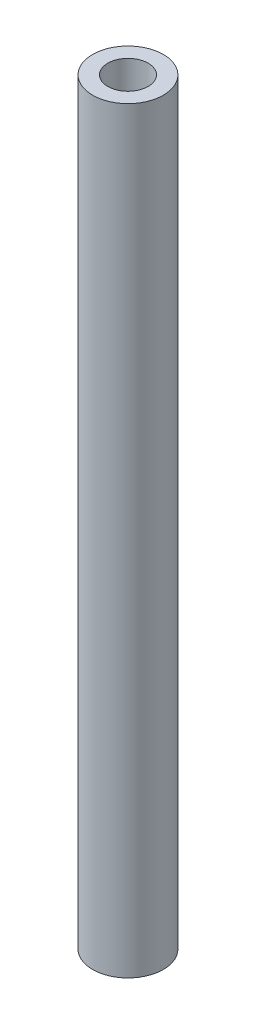
ISO-10303-21;
HEADER;
FILE_DESCRIPTION(('STEP AP214'),'2;1');
FILE_NAME('part.step','',(''),(''),'','','');
FILE_SCHEMA(('AUTOMOTIVE_DESIGN { 1 0 10303 214 1 1 1 1 }'));
ENDSEC;
DATA;
#1=APPLICATION_CONTEXT('core data for automotive mechanical design processes');
#2=APPLICATION_PROTOCOL_DEFINITION('international standard','automotive_design',2000,#1);
#3=PRODUCT_CONTEXT('',#1,'mechanical');
#4=PRODUCT('Part','Part','',(#3));
#5=PRODUCT_RELATED_PRODUCT_CATEGORY('part','',(#4));
#6=PRODUCT_DEFINITION_FORMATION('','',#4);
#7=PRODUCT_DEFINITION_CONTEXT('part definition',#1,'design');
#8=PRODUCT_DEFINITION('design','',#6,#7);
#9=PRODUCT_DEFINITION_SHAPE('','',#8);
#10=(LENGTH_UNIT() NAMED_UNIT(*) SI_UNIT(.MILLI.,.METRE.));
#11=(NAMED_UNIT(*) PLANE_ANGLE_UNIT() SI_UNIT($,.RADIAN.));
#12=(NAMED_UNIT(*) SI_UNIT($,.STERADIAN.) SOLID_ANGLE_UNIT());
#13=UNCERTAINTY_MEASURE_WITH_UNIT(LENGTH_MEASURE(1.E-05),#10,'distance_accuracy_value','');
#14=(GEOMETRIC_REPRESENTATION_CONTEXT(3) GLOBAL_UNCERTAINTY_ASSIGNED_CONTEXT((#13)) GLOBAL_UNIT_ASSIGNED_CONTEXT((#10,
#11,#12)) REPRESENTATION_CONTEXT('',''));
#15=CARTESIAN_POINT('',(0.,0.,0.));
#16=DIRECTION('',(0.,0.,1.));
#17=DIRECTION('',(1.,0.,0.));
#18=AXIS2_PLACEMENT_3D('',#15,#16,#17);
#19=CARTESIAN_POINT('',(-56.7146055400372,-75.,0.));
#20=DIRECTION('',(0.,1.,0.));
#21=DIRECTION('',(-1.,0.,0.));
#22=AXIS2_PLACEMENT_3D('',#19,#20,#21);
#23=CYLINDRICAL_SURFACE('',#22,3.50000000000001);
#24=CARTESIAN_POINT('',(-56.7146055400372,-75.,0.));
#25=DIRECTION('',(0.,1.,0.));
#26=DIRECTION('',(-1.,0.,0.));
#27=AXIS2_PLACEMENT_3D('',#24,#25,#26);
#28=CIRCLE('',#27,3.50000000000001);
#29=CARTESIAN_POINT('',(-60.2146055400372,-75.,0.));
#30=VERTEX_POINT('',#29);
#31=EDGE_CURVE('E10',#30,#30,#28,.T.);
#32=ORIENTED_EDGE('',*,*,#31,.T.);
#33=EDGE_LOOP('',(#32));
#34=FACE_BOUND('',#33,.T.);
#35=CARTESIAN_POINT('',(-56.7146055400372,0.,0.));
#36=DIRECTION('',(0.,1.,0.));
#37=DIRECTION('',(-1.,0.,0.));
#38=AXIS2_PLACEMENT_3D('',#35,#36,#37);
#39=CIRCLE('',#38,3.5);
#40=CARTESIAN_POINT('',(-60.2146055400372,0.,0.));
#41=VERTEX_POINT('',#40);
#42=EDGE_CURVE('E47',#41,#41,#39,.T.);
#43=ORIENTED_EDGE('',*,*,#42,.F.);
#44=EDGE_LOOP('',(#43));
#45=FACE_BOUND('',#44,.T.);
#46=ADVANCED_FACE('F33',(#34,#45),#23,.T.);
#47=CARTESIAN_POINT('',(-53.2146055400372,-75.,0.));
#48=DIRECTION('',(0.,-1.,0.));
#49=DIRECTION('',(1.,0.,0.));
#50=AXIS2_PLACEMENT_3D('',#47,#48,#49);
#51=PLANE('',#50);
#52=CARTESIAN_POINT('',(-56.7146055400372,-75.,0.));
#53=DIRECTION('',(0.,1.,0.));
#54=DIRECTION('',(-1.,0.,0.));
#55=AXIS2_PLACEMENT_3D('',#52,#53,#54);
#56=CIRCLE('',#55,2.);
#57=CARTESIAN_POINT('',(-58.7146055400372,-75.,0.));
#58=VERTEX_POINT('',#57);
#59=EDGE_CURVE('E39',#58,#58,#56,.T.);
#60=ORIENTED_EDGE('',*,*,#59,.T.);
#61=EDGE_LOOP('',(#60));
#62=FACE_BOUND('',#61,.T.);
#63=ORIENTED_EDGE('',*,*,#31,.F.);
#64=EDGE_LOOP('',(#63));
#65=FACE_BOUND('',#64,.T.);
#66=ADVANCED_FACE('F57',(#62,#65),#51,.T.);
#67=CARTESIAN_POINT('',(-56.7146055400372,-75.,0.));
#68=DIRECTION('',(0.,1.,0.));
#69=DIRECTION('',(-1.,0.,0.));
#70=AXIS2_PLACEMENT_3D('',#67,#68,#69);
#71=CYLINDRICAL_SURFACE('',#70,2.);
#72=CARTESIAN_POINT('',(-56.7146055400372,0.,0.));
#73=DIRECTION('',(0.,1.,0.));
#74=DIRECTION('',(-1.,0.,0.));
#75=AXIS2_PLACEMENT_3D('',#72,#73,#74);
#76=CIRCLE('',#75,2.);
#77=CARTESIAN_POINT('',(-58.7146055400372,0.,0.));
#78=VERTEX_POINT('',#77);
#79=EDGE_CURVE('E43',#78,#78,#76,.T.);
#80=ORIENTED_EDGE('',*,*,#79,.T.);
#81=EDGE_LOOP('',(#80));
#82=FACE_BOUND('',#81,.T.);
#83=ORIENTED_EDGE('',*,*,#59,.F.);
#84=EDGE_LOOP('',(#83));
#85=FACE_BOUND('',#84,.T.);
#86=ADVANCED_FACE('F61',(#82,#85),#71,.F.);
#87=CARTESIAN_POINT('',(-54.7146055400372,0.,0.));
#88=DIRECTION('',(0.,1.,0.));
#89=DIRECTION('',(-1.,0.,0.));
#90=AXIS2_PLACEMENT_3D('',#87,#88,#89);
#91=PLANE('',#90);
#92=ORIENTED_EDGE('',*,*,#42,.T.);
#93=EDGE_LOOP('',(#92));
#94=FACE_BOUND('',#93,.T.);
#95=ORIENTED_EDGE('',*,*,#79,.F.);
#96=EDGE_LOOP('',(#95));
#97=FACE_BOUND('',#96,.T.);
#98=ADVANCED_FACE('F53',(#94,#97),#91,.T.);
#99=CLOSED_SHELL('',(#46,#66,#86,#98));
#100=MANIFOLD_SOLID_BREP('B2',#99);
#101=ADVANCED_BREP_SHAPE_REPRESENTATION('',(#18,#100),#14);
#102=SHAPE_DEFINITION_REPRESENTATION(#9,#101);
ENDSEC;
END-ISO-10303-21;
